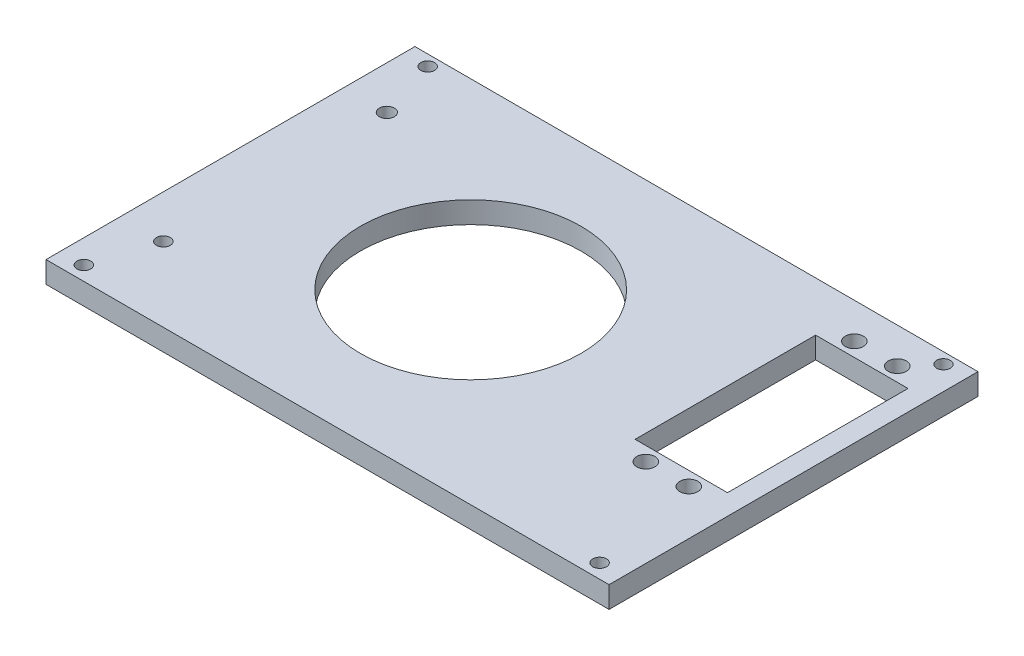
ISO-10303-21;
HEADER;
FILE_DESCRIPTION(('STEP AP214'),'2;1');
FILE_NAME('part.step','',(''),(''),'','','');
FILE_SCHEMA(('AUTOMOTIVE_DESIGN { 1 0 10303 214 1 1 1 1 }'));
ENDSEC;
DATA;
#1=APPLICATION_CONTEXT('core data for automotive mechanical design processes');
#2=APPLICATION_PROTOCOL_DEFINITION('international standard','automotive_design',2000,#1);
#3=PRODUCT_CONTEXT('',#1,'mechanical');
#4=PRODUCT('Part','Part','',(#3));
#5=PRODUCT_RELATED_PRODUCT_CATEGORY('part','',(#4));
#6=PRODUCT_DEFINITION_FORMATION('','',#4);
#7=PRODUCT_DEFINITION_CONTEXT('part definition',#1,'design');
#8=PRODUCT_DEFINITION('design','',#6,#7);
#9=PRODUCT_DEFINITION_SHAPE('','',#8);
#10=(LENGTH_UNIT() NAMED_UNIT(*) SI_UNIT(.MILLI.,.METRE.));
#11=(NAMED_UNIT(*) PLANE_ANGLE_UNIT() SI_UNIT($,.RADIAN.));
#12=(NAMED_UNIT(*) SI_UNIT($,.STERADIAN.) SOLID_ANGLE_UNIT());
#13=UNCERTAINTY_MEASURE_WITH_UNIT(LENGTH_MEASURE(1.E-05),#10,'distance_accuracy_value','');
#14=(GEOMETRIC_REPRESENTATION_CONTEXT(3) GLOBAL_UNCERTAINTY_ASSIGNED_CONTEXT((#13)) GLOBAL_UNIT_ASSIGNED_CONTEXT((#10,
#11,#12)) REPRESENTATION_CONTEXT('',''));
#15=CARTESIAN_POINT('',(0.,0.,0.));
#16=DIRECTION('',(0.,0.,1.));
#17=DIRECTION('',(1.,0.,0.));
#18=AXIS2_PLACEMENT_3D('',#15,#16,#17);
#19=CARTESIAN_POINT('',(0.,5.,0.));
#20=DIRECTION('',(0.,-1.,0.));
#21=DIRECTION('',(0.,0.,-1.));
#22=AXIS2_PLACEMENT_3D('',#19,#20,#21);
#23=PLANE('',#22);
#24=CARTESIAN_POINT('',(-60.0000000000002,5.,-39.9999999999992));
#25=DIRECTION('',(0.,1.,0.));
#26=DIRECTION('',(0.,0.,1.));
#27=AXIS2_PLACEMENT_3D('',#24,#25,#26);
#28=CIRCLE('',#27,1.6);
#29=CARTESIAN_POINT('',(-60.0000000000002,5.,-38.3999999999992));
#30=VERTEX_POINT('',#29);
#31=EDGE_CURVE('E137',#30,#30,#28,.T.);
#32=ORIENTED_EDGE('',*,*,#31,.F.);
#33=EDGE_LOOP('',(#32));
#34=FACE_BOUND('',#33,.T.);
#35=CARTESIAN_POINT('',(-10.,5.,0.));
#36=DIRECTION('',(0.,1.,0.));
#37=DIRECTION('',(0.,0.,1.));
#38=AXIS2_PLACEMENT_3D('',#35,#36,#37);
#39=CIRCLE('',#38,25.65);
#40=CARTESIAN_POINT('',(-10.,5.,25.65));
#41=VERTEX_POINT('',#40);
#42=EDGE_CURVE('E143',#41,#41,#39,.T.);
#43=ORIENTED_EDGE('',*,*,#42,.F.);
#44=EDGE_LOOP('',(#43));
#45=FACE_BOUND('',#44,.T.);
#46=CARTESIAN_POINT('',(55.,5.,-34.25));
#47=DIRECTION('',(0.,1.,0.));
#48=DIRECTION('',(0.,0.,1.));
#49=AXIS2_PLACEMENT_3D('',#46,#47,#48);
#50=CIRCLE('',#49,2.1);
#51=CARTESIAN_POINT('',(55.,5.,-32.15));
#52=VERTEX_POINT('',#51);
#53=EDGE_CURVE('E149',#52,#52,#50,.T.);
#54=ORIENTED_EDGE('',*,*,#53,.F.);
#55=EDGE_LOOP('',(#54));
#56=FACE_BOUND('',#55,.T.);
#57=CARTESIAN_POINT('',(-55.5000000000002,5.,-26.));
#58=DIRECTION('',(0.,1.,0.));
#59=DIRECTION('',(0.,0.,1.));
#60=AXIS2_PLACEMENT_3D('',#57,#58,#59);
#61=CIRCLE('',#60,1.75);
#62=CARTESIAN_POINT('',(-55.5000000000002,5.,-24.25));
#63=VERTEX_POINT('',#62);
#64=EDGE_CURVE('E155',#63,#63,#61,.T.);
#65=ORIENTED_EDGE('',*,*,#64,.F.);
#66=EDGE_LOOP('',(#65));
#67=FACE_BOUND('',#66,.T.);
#68=CARTESIAN_POINT('',(45.,5.,-34.25));
#69=DIRECTION('',(0.,1.,0.));
#70=DIRECTION('',(0.,0.,1.));
#71=AXIS2_PLACEMENT_3D('',#68,#69,#70);
#72=CIRCLE('',#71,2.1);
#73=CARTESIAN_POINT('',(45.,5.,-32.15));
#74=VERTEX_POINT('',#73);
#75=EDGE_CURVE('E161',#74,#74,#72,.T.);
#76=ORIENTED_EDGE('',*,*,#75,.F.);
#77=EDGE_LOOP('',(#76));
#78=FACE_BOUND('',#77,.T.);
#79=CARTESIAN_POINT('',(59.9999999999998,5.,-40.));
#80=DIRECTION('',(0.,1.,0.));
#81=DIRECTION('',(0.,0.,1.));
#82=AXIS2_PLACEMENT_3D('',#79,#80,#81);
#83=CIRCLE('',#82,1.6);
#84=CARTESIAN_POINT('',(59.9999999999998,5.,-38.4));
#85=VERTEX_POINT('',#84);
#86=EDGE_CURVE('E167',#85,#85,#83,.T.);
#87=ORIENTED_EDGE('',*,*,#86,.F.);
#88=EDGE_LOOP('',(#87));
#89=FACE_BOUND('',#88,.T.);
#90=CARTESIAN_POINT('',(60.,5.,40.));
#91=DIRECTION('',(0.,1.,0.));
#92=DIRECTION('',(0.,0.,1.));
#93=AXIS2_PLACEMENT_3D('',#90,#91,#92);
#94=CIRCLE('',#93,1.6);
#95=CARTESIAN_POINT('',(60.,5.,41.6));
#96=VERTEX_POINT('',#95);
#97=EDGE_CURVE('E173',#96,#96,#94,.T.);
#98=ORIENTED_EDGE('',*,*,#97,.F.);
#99=EDGE_LOOP('',(#98));
#100=FACE_BOUND('',#99,.T.);
#101=CARTESIAN_POINT('',(-60.,5.,40.0000000000008));
#102=DIRECTION('',(0.,1.,0.));
#103=DIRECTION('',(0.,0.,1.));
#104=AXIS2_PLACEMENT_3D('',#101,#102,#103);
#105=CIRCLE('',#104,1.6);
#106=CARTESIAN_POINT('',(-60.,5.,41.6000000000008));
#107=VERTEX_POINT('',#106);
#108=EDGE_CURVE('E179',#107,#107,#105,.T.);
#109=ORIENTED_EDGE('',*,*,#108,.F.);
#110=EDGE_LOOP('',(#109));
#111=FACE_BOUND('',#110,.T.);
#112=CARTESIAN_POINT('',(-55.5,5.,26.));
#113=DIRECTION('',(0.,1.,0.));
#114=DIRECTION('',(0.,0.,1.));
#115=AXIS2_PLACEMENT_3D('',#112,#113,#114);
#116=CIRCLE('',#115,1.6);
#117=CARTESIAN_POINT('',(-55.5,5.,27.6));
#118=VERTEX_POINT('',#117);
#119=EDGE_CURVE('E185',#118,#118,#116,.T.);
#120=ORIENTED_EDGE('',*,*,#119,.F.);
#121=EDGE_LOOP('',(#120));
#122=FACE_BOUND('',#121,.T.);
#123=DIRECTION('',(-1.,0.,0.));
#124=VECTOR('',#123,1.);
#125=CARTESIAN_POINT('',(-65.5,5.,-42.5319738960787));
#126=LINE('',#125,#124);
#127=CARTESIAN_POINT('',(65.5,5.,-42.5319738960787));
#128=VERTEX_POINT('',#127);
#129=CARTESIAN_POINT('',(-65.5,5.,-42.5319738960787));
#130=VERTEX_POINT('',#129);
#131=EDGE_CURVE('E191',#128,#130,#126,.T.);
#132=ORIENTED_EDGE('',*,*,#131,.T.);
#133=DIRECTION('',(0.,0.,1.));
#134=VECTOR('',#133,1.);
#135=CARTESIAN_POINT('',(-65.5,5.,-42.5319738960787));
#136=LINE('',#135,#134);
#137=CARTESIAN_POINT('',(-65.5,5.,43.3037538041827));
#138=VERTEX_POINT('',#137);
#139=EDGE_CURVE('E194',#130,#138,#136,.T.);
#140=ORIENTED_EDGE('',*,*,#139,.T.);
#141=DIRECTION('',(1.,0.,0.));
#142=VECTOR('',#141,1.);
#143=CARTESIAN_POINT('',(65.5,5.,43.3037538041826));
#144=LINE('',#143,#142);
#145=CARTESIAN_POINT('',(65.5,5.,43.3037538041826));
#146=VERTEX_POINT('',#145);
#147=EDGE_CURVE('E197',#138,#146,#144,.T.);
#148=ORIENTED_EDGE('',*,*,#147,.T.);
#149=DIRECTION('',(0.,0.,-1.));
#150=VECTOR('',#149,1.);
#151=CARTESIAN_POINT('',(65.5,5.,-42.5319738960787));
#152=LINE('',#151,#150);
#153=EDGE_CURVE('E199',#146,#128,#152,.T.);
#154=ORIENTED_EDGE('',*,*,#153,.T.);
#155=EDGE_LOOP('',(#132,#140,#148,#154));
#156=FACE_BOUND('',#155,.T.);
#157=DIRECTION('',(0.,0.,-1.));
#158=VECTOR('',#157,1.);
#159=CARTESIAN_POINT('',(60.75,5.,-31.));
#160=LINE('',#159,#158);
#161=CARTESIAN_POINT('',(60.75,5.,11.));
#162=VERTEX_POINT('',#161);
#163=CARTESIAN_POINT('',(60.75,5.,-31.));
#164=VERTEX_POINT('',#163);
#165=EDGE_CURVE('E98',#162,#164,#160,.T.);
#166=ORIENTED_EDGE('',*,*,#165,.F.);
#167=DIRECTION('',(1.,0.,0.));
#168=VECTOR('',#167,1.);
#169=CARTESIAN_POINT('',(39.25,5.,11.));
#170=LINE('',#169,#168);
#171=CARTESIAN_POINT('',(39.25,5.,11.));
#172=VERTEX_POINT('',#171);
#173=EDGE_CURVE('E121',#172,#162,#170,.T.);
#174=ORIENTED_EDGE('',*,*,#173,.F.);
#175=DIRECTION('',(0.,0.,1.));
#176=VECTOR('',#175,1.);
#177=CARTESIAN_POINT('',(39.25,5.,-31.));
#178=LINE('',#177,#176);
#179=CARTESIAN_POINT('',(39.25,5.,-31.));
#180=VERTEX_POINT('',#179);
#181=EDGE_CURVE('E119',#180,#172,#178,.T.);
#182=ORIENTED_EDGE('',*,*,#181,.F.);
#183=DIRECTION('',(-1.,0.,0.));
#184=VECTOR('',#183,1.);
#185=CARTESIAN_POINT('',(39.25,5.,-31.));
#186=LINE('',#185,#184);
#187=EDGE_CURVE('E106',#164,#180,#186,.T.);
#188=ORIENTED_EDGE('',*,*,#187,.F.);
#189=EDGE_LOOP('',(#166,#174,#182,#188));
#190=FACE_BOUND('',#189,.T.);
#191=CARTESIAN_POINT('',(45.0000000000005,5.,14.25));
#192=DIRECTION('',(0.,1.,0.));
#193=DIRECTION('',(0.,0.,1.));
#194=AXIS2_PLACEMENT_3D('',#191,#192,#193);
#195=CIRCLE('',#194,2.1);
#196=CARTESIAN_POINT('',(45.0000000000005,5.,16.35));
#197=VERTEX_POINT('',#196);
#198=EDGE_CURVE('E127',#197,#197,#195,.T.);
#199=ORIENTED_EDGE('',*,*,#198,.F.);
#200=EDGE_LOOP('',(#199));
#201=FACE_BOUND('',#200,.T.);
#202=CARTESIAN_POINT('',(55.0000000000005,5.,14.25));
#203=DIRECTION('',(0.,1.,0.));
#204=DIRECTION('',(0.,0.,1.));
#205=AXIS2_PLACEMENT_3D('',#202,#203,#204);
#206=CIRCLE('',#205,2.1);
#207=CARTESIAN_POINT('',(55.0000000000005,5.,16.35));
#208=VERTEX_POINT('',#207);
#209=EDGE_CURVE('E283',#208,#208,#206,.T.);
#210=ORIENTED_EDGE('',*,*,#209,.F.);
#211=EDGE_LOOP('',(#210));
#212=FACE_BOUND('',#211,.T.);
#213=ADVANCED_FACE('F33',(#34,#45,#56,#67,#78,#89,#100,#111,#122,#156,#190,#201,#212),#23,.F.);
#214=CARTESIAN_POINT('',(0.,0.,0.));
#215=DIRECTION('',(0.,-1.,0.));
#216=DIRECTION('',(0.,0.,-1.));
#217=AXIS2_PLACEMENT_3D('',#214,#215,#216);
#218=PLANE('',#217);
#219=CARTESIAN_POINT('',(45.0000000000005,0.,14.25));
#220=DIRECTION('',(0.,1.,0.));
#221=DIRECTION('',(0.,0.,1.));
#222=AXIS2_PLACEMENT_3D('',#219,#220,#221);
#223=CIRCLE('',#222,2.1);
#224=CARTESIAN_POINT('',(45.0000000000005,0.,16.35));
#225=VERTEX_POINT('',#224);
#226=EDGE_CURVE('E286',#225,#225,#223,.T.);
#227=ORIENTED_EDGE('',*,*,#226,.T.);
#228=EDGE_LOOP('',(#227));
#229=FACE_BOUND('',#228,.T.);
#230=CARTESIAN_POINT('',(-10.,0.,0.));
#231=DIRECTION('',(0.,1.,0.));
#232=DIRECTION('',(0.,0.,1.));
#233=AXIS2_PLACEMENT_3D('',#230,#231,#232);
#234=CIRCLE('',#233,25.65);
#235=CARTESIAN_POINT('',(-10.,0.,25.65));
#236=VERTEX_POINT('',#235);
#237=EDGE_CURVE('E140',#236,#236,#234,.T.);
#238=ORIENTED_EDGE('',*,*,#237,.T.);
#239=EDGE_LOOP('',(#238));
#240=FACE_BOUND('',#239,.T.);
#241=CARTESIAN_POINT('',(-55.5000000000002,0.,-26.));
#242=DIRECTION('',(0.,1.,0.));
#243=DIRECTION('',(0.,0.,1.));
#244=AXIS2_PLACEMENT_3D('',#241,#242,#243);
#245=CIRCLE('',#244,1.75);
#246=CARTESIAN_POINT('',(-55.5000000000002,0.,-24.25));
#247=VERTEX_POINT('',#246);
#248=EDGE_CURVE('E152',#247,#247,#245,.T.);
#249=ORIENTED_EDGE('',*,*,#248,.T.);
#250=EDGE_LOOP('',(#249));
#251=FACE_BOUND('',#250,.T.);
#252=CARTESIAN_POINT('',(59.9999999999998,0.,-40.));
#253=DIRECTION('',(0.,1.,0.));
#254=DIRECTION('',(0.,0.,1.));
#255=AXIS2_PLACEMENT_3D('',#252,#253,#254);
#256=CIRCLE('',#255,1.6);
#257=CARTESIAN_POINT('',(59.9999999999998,0.,-38.4));
#258=VERTEX_POINT('',#257);
#259=EDGE_CURVE('E164',#258,#258,#256,.T.);
#260=ORIENTED_EDGE('',*,*,#259,.T.);
#261=EDGE_LOOP('',(#260));
#262=FACE_BOUND('',#261,.T.);
#263=CARTESIAN_POINT('',(-60.,0.,40.0000000000008));
#264=DIRECTION('',(0.,1.,0.));
#265=DIRECTION('',(0.,0.,1.));
#266=AXIS2_PLACEMENT_3D('',#263,#264,#265);
#267=CIRCLE('',#266,1.6);
#268=CARTESIAN_POINT('',(-60.,0.,41.6000000000008));
#269=VERTEX_POINT('',#268);
#270=EDGE_CURVE('E176',#269,#269,#267,.T.);
#271=ORIENTED_EDGE('',*,*,#270,.T.);
#272=EDGE_LOOP('',(#271));
#273=FACE_BOUND('',#272,.T.);
#274=DIRECTION('',(-1.,0.,0.));
#275=VECTOR('',#274,1.);
#276=CARTESIAN_POINT('',(-65.5,0.,-42.5319738960787));
#277=LINE('',#276,#275);
#278=CARTESIAN_POINT('',(65.5,0.,-42.5319738960787));
#279=VERTEX_POINT('',#278);
#280=CARTESIAN_POINT('',(-65.5,0.,-42.5319738960787));
#281=VERTEX_POINT('',#280);
#282=EDGE_CURVE('E188',#279,#281,#277,.T.);
#283=ORIENTED_EDGE('',*,*,#282,.F.);
#284=DIRECTION('',(0.,0.,-1.));
#285=VECTOR('',#284,1.);
#286=CARTESIAN_POINT('',(65.5,0.,-42.5319738960787));
#287=LINE('',#286,#285);
#288=CARTESIAN_POINT('',(65.5,0.,43.3037538041826));
#289=VERTEX_POINT('',#288);
#290=EDGE_CURVE('E195',#289,#279,#287,.T.);
#291=ORIENTED_EDGE('',*,*,#290,.F.);
#292=DIRECTION('',(1.,0.,0.));
#293=VECTOR('',#292,1.);
#294=CARTESIAN_POINT('',(65.5,0.,43.3037538041826));
#295=LINE('',#294,#293);
#296=CARTESIAN_POINT('',(-65.5,0.,43.3037538041827));
#297=VERTEX_POINT('',#296);
#298=EDGE_CURVE('E206',#297,#289,#295,.T.);
#299=ORIENTED_EDGE('',*,*,#298,.F.);
#300=DIRECTION('',(0.,0.,1.));
#301=VECTOR('',#300,1.);
#302=CARTESIAN_POINT('',(-65.5,0.,-42.5319738960787));
#303=LINE('',#302,#301);
#304=EDGE_CURVE('E204',#281,#297,#303,.T.);
#305=ORIENTED_EDGE('',*,*,#304,.F.);
#306=EDGE_LOOP('',(#283,#291,#299,#305));
#307=FACE_BOUND('',#306,.T.);
#308=CARTESIAN_POINT('',(-55.5,0.,26.));
#309=DIRECTION('',(0.,1.,0.));
#310=DIRECTION('',(0.,0.,1.));
#311=AXIS2_PLACEMENT_3D('',#308,#309,#310);
#312=CIRCLE('',#311,1.6);
#313=CARTESIAN_POINT('',(-55.5,0.,27.6));
#314=VERTEX_POINT('',#313);
#315=EDGE_CURVE('E182',#314,#314,#312,.T.);
#316=ORIENTED_EDGE('',*,*,#315,.T.);
#317=EDGE_LOOP('',(#316));
#318=FACE_BOUND('',#317,.T.);
#319=CARTESIAN_POINT('',(60.,0.,40.));
#320=DIRECTION('',(0.,1.,0.));
#321=DIRECTION('',(0.,0.,1.));
#322=AXIS2_PLACEMENT_3D('',#319,#320,#321);
#323=CIRCLE('',#322,1.6);
#324=CARTESIAN_POINT('',(60.,0.,41.6));
#325=VERTEX_POINT('',#324);
#326=EDGE_CURVE('E170',#325,#325,#323,.T.);
#327=ORIENTED_EDGE('',*,*,#326,.T.);
#328=EDGE_LOOP('',(#327));
#329=FACE_BOUND('',#328,.T.);
#330=CARTESIAN_POINT('',(45.,0.,-34.25));
#331=DIRECTION('',(0.,1.,0.));
#332=DIRECTION('',(0.,0.,1.));
#333=AXIS2_PLACEMENT_3D('',#330,#331,#332);
#334=CIRCLE('',#333,2.1);
#335=CARTESIAN_POINT('',(45.,0.,-32.15));
#336=VERTEX_POINT('',#335);
#337=EDGE_CURVE('E158',#336,#336,#334,.T.);
#338=ORIENTED_EDGE('',*,*,#337,.T.);
#339=EDGE_LOOP('',(#338));
#340=FACE_BOUND('',#339,.T.);
#341=CARTESIAN_POINT('',(55.,0.,-34.25));
#342=DIRECTION('',(0.,1.,0.));
#343=DIRECTION('',(0.,0.,1.));
#344=AXIS2_PLACEMENT_3D('',#341,#342,#343);
#345=CIRCLE('',#344,2.1);
#346=CARTESIAN_POINT('',(55.,0.,-32.15));
#347=VERTEX_POINT('',#346);
#348=EDGE_CURVE('E146',#347,#347,#345,.T.);
#349=ORIENTED_EDGE('',*,*,#348,.T.);
#350=EDGE_LOOP('',(#349));
#351=FACE_BOUND('',#350,.T.);
#352=CARTESIAN_POINT('',(-60.0000000000002,0.,-39.9999999999992));
#353=DIRECTION('',(0.,1.,0.));
#354=DIRECTION('',(0.,0.,1.));
#355=AXIS2_PLACEMENT_3D('',#352,#353,#354);
#356=CIRCLE('',#355,1.6);
#357=CARTESIAN_POINT('',(-60.0000000000002,0.,-38.3999999999992));
#358=VERTEX_POINT('',#357);
#359=EDGE_CURVE('E114',#358,#358,#356,.T.);
#360=ORIENTED_EDGE('',*,*,#359,.T.);
#361=EDGE_LOOP('',(#360));
#362=FACE_BOUND('',#361,.T.);
#363=DIRECTION('',(1.,0.,0.));
#364=VECTOR('',#363,1.);
#365=CARTESIAN_POINT('',(39.25,0.,11.));
#366=LINE('',#365,#364);
#367=CARTESIAN_POINT('',(39.25,0.,11.));
#368=VERTEX_POINT('',#367);
#369=CARTESIAN_POINT('',(60.75,0.,11.));
#370=VERTEX_POINT('',#369);
#371=EDGE_CURVE('E107',#368,#370,#366,.T.);
#372=ORIENTED_EDGE('',*,*,#371,.T.);
#373=DIRECTION('',(0.,0.,-1.));
#374=VECTOR('',#373,1.);
#375=CARTESIAN_POINT('',(60.75,0.,-31.));
#376=LINE('',#375,#374);
#377=CARTESIAN_POINT('',(60.75,0.,-31.));
#378=VERTEX_POINT('',#377);
#379=EDGE_CURVE('E56',#370,#378,#376,.T.);
#380=ORIENTED_EDGE('',*,*,#379,.T.);
#381=DIRECTION('',(-1.,0.,0.));
#382=VECTOR('',#381,1.);
#383=CARTESIAN_POINT('',(39.25,0.,-31.));
#384=LINE('',#383,#382);
#385=CARTESIAN_POINT('',(39.25,0.,-31.));
#386=VERTEX_POINT('',#385);
#387=EDGE_CURVE('E113',#378,#386,#384,.T.);
#388=ORIENTED_EDGE('',*,*,#387,.T.);
#389=DIRECTION('',(0.,0.,1.));
#390=VECTOR('',#389,1.);
#391=CARTESIAN_POINT('',(39.25,0.,-31.));
#392=LINE('',#391,#390);
#393=EDGE_CURVE('E129',#386,#368,#392,.T.);
#394=ORIENTED_EDGE('',*,*,#393,.T.);
#395=EDGE_LOOP('',(#372,#380,#388,#394));
#396=FACE_BOUND('',#395,.T.);
#397=CARTESIAN_POINT('',(55.0000000000005,0.,14.25));
#398=DIRECTION('',(0.,1.,0.));
#399=DIRECTION('',(0.,0.,1.));
#400=AXIS2_PLACEMENT_3D('',#397,#398,#399);
#401=CIRCLE('',#400,2.1);
#402=CARTESIAN_POINT('',(55.0000000000005,0.,16.35));
#403=VERTEX_POINT('',#402);
#404=EDGE_CURVE('E281',#403,#403,#401,.T.);
#405=ORIENTED_EDGE('',*,*,#404,.T.);
#406=EDGE_LOOP('',(#405));
#407=FACE_BOUND('',#406,.T.);
#408=ADVANCED_FACE('F224',(#229,#240,#251,#262,#273,#307,#318,#329,#340,#351,#362,#396,#407),
#218,.T.);
#409=CARTESIAN_POINT('',(-65.5,5.,-42.5319738960787));
#410=DIRECTION('',(0.,0.,1.));
#411=DIRECTION('',(1.,0.,0.));
#412=AXIS2_PLACEMENT_3D('',#409,#410,#411);
#413=PLANE('',#412);
#414=ORIENTED_EDGE('',*,*,#282,.T.);
#415=DIRECTION('',(0.,-1.,0.));
#416=VECTOR('',#415,1.);
#417=CARTESIAN_POINT('',(-65.5,5.,-42.5319738960787));
#418=LINE('',#417,#416);
#419=EDGE_CURVE('E11',#130,#281,#418,.T.);
#420=ORIENTED_EDGE('',*,*,#419,.F.);
#421=ORIENTED_EDGE('',*,*,#131,.F.);
#422=DIRECTION('',(0.,-1.,0.));
#423=VECTOR('',#422,1.);
#424=CARTESIAN_POINT('',(65.5,5.,-42.5319738960787));
#425=LINE('',#424,#423);
#426=EDGE_CURVE('E201',#128,#279,#425,.T.);
#427=ORIENTED_EDGE('',*,*,#426,.T.);
#428=EDGE_LOOP('',(#414,#420,#421,#427));
#429=FACE_BOUND('',#428,.T.);
#430=ADVANCED_FACE('F35',(#429),#413,.F.);
#431=CARTESIAN_POINT('',(-65.5,5.,-42.5319738960787));
#432=DIRECTION('',(1.,0.,0.));
#433=DIRECTION('',(0.,0.,-1.));
#434=AXIS2_PLACEMENT_3D('',#431,#432,#433);
#435=PLANE('',#434);
#436=ORIENTED_EDGE('',*,*,#304,.T.);
#437=DIRECTION('',(0.,-1.,0.));
#438=VECTOR('',#437,1.);
#439=CARTESIAN_POINT('',(-65.5,5.,43.3037538041827));
#440=LINE('',#439,#438);
#441=EDGE_CURVE('E41',#138,#297,#440,.T.);
#442=ORIENTED_EDGE('',*,*,#441,.F.);
#443=ORIENTED_EDGE('',*,*,#139,.F.);
#444=ORIENTED_EDGE('',*,*,#419,.T.);
#445=EDGE_LOOP('',(#436,#442,#443,#444));
#446=FACE_BOUND('',#445,.T.);
#447=ADVANCED_FACE('F234',(#446),#435,.F.);
#448=CARTESIAN_POINT('',(65.5,5.,43.3037538041826));
#449=DIRECTION('',(0.,0.,-1.));
#450=DIRECTION('',(-1.,0.,0.));
#451=AXIS2_PLACEMENT_3D('',#448,#449,#450);
#452=PLANE('',#451);
#453=ORIENTED_EDGE('',*,*,#298,.T.);
#454=DIRECTION('',(0.,-1.,0.));
#455=VECTOR('',#454,1.);
#456=CARTESIAN_POINT('',(65.5,5.,43.3037538041826));
#457=LINE('',#456,#455);
#458=EDGE_CURVE('E211',#146,#289,#457,.T.);
#459=ORIENTED_EDGE('',*,*,#458,.F.);
#460=ORIENTED_EDGE('',*,*,#147,.F.);
#461=ORIENTED_EDGE('',*,*,#441,.T.);
#462=EDGE_LOOP('',(#453,#459,#460,#461));
#463=FACE_BOUND('',#462,.T.);
#464=ADVANCED_FACE('F218',(#463),#452,.F.);
#465=CARTESIAN_POINT('',(65.5,5.,-42.5319738960787));
#466=DIRECTION('',(-1.,0.,0.));
#467=DIRECTION('',(0.,0.,1.));
#468=AXIS2_PLACEMENT_3D('',#465,#466,#467);
#469=PLANE('',#468);
#470=ORIENTED_EDGE('',*,*,#290,.T.);
#471=ORIENTED_EDGE('',*,*,#426,.F.);
#472=ORIENTED_EDGE('',*,*,#153,.F.);
#473=ORIENTED_EDGE('',*,*,#458,.T.);
#474=EDGE_LOOP('',(#470,#471,#472,#473));
#475=FACE_BOUND('',#474,.T.);
#476=ADVANCED_FACE('F228',(#475),#469,.F.);
#477=CARTESIAN_POINT('',(-55.5,5.,26.));
#478=DIRECTION('',(0.,-1.,0.));
#479=DIRECTION('',(0.,0.,-1.));
#480=AXIS2_PLACEMENT_3D('',#477,#478,#479);
#481=CYLINDRICAL_SURFACE('',#480,1.6);
#482=ORIENTED_EDGE('',*,*,#119,.T.);
#483=EDGE_LOOP('',(#482));
#484=FACE_BOUND('',#483,.T.);
#485=ORIENTED_EDGE('',*,*,#315,.F.);
#486=EDGE_LOOP('',(#485));
#487=FACE_BOUND('',#486,.T.);
#488=ADVANCED_FACE('F252',(#484,#487),#481,.F.);
#489=CARTESIAN_POINT('',(-60.,5.,40.0000000000008));
#490=DIRECTION('',(0.,-1.,0.));
#491=DIRECTION('',(0.,0.,-1.));
#492=AXIS2_PLACEMENT_3D('',#489,#490,#491);
#493=CYLINDRICAL_SURFACE('',#492,1.6);
#494=ORIENTED_EDGE('',*,*,#108,.T.);
#495=EDGE_LOOP('',(#494));
#496=FACE_BOUND('',#495,.T.);
#497=ORIENTED_EDGE('',*,*,#270,.F.);
#498=EDGE_LOOP('',(#497));
#499=FACE_BOUND('',#498,.T.);
#500=ADVANCED_FACE('F259',(#496,#499),#493,.F.);
#501=CARTESIAN_POINT('',(60.,5.,40.));
#502=DIRECTION('',(0.,-1.,0.));
#503=DIRECTION('',(0.,0.,-1.));
#504=AXIS2_PLACEMENT_3D('',#501,#502,#503);
#505=CYLINDRICAL_SURFACE('',#504,1.6);
#506=ORIENTED_EDGE('',*,*,#97,.T.);
#507=EDGE_LOOP('',(#506));
#508=FACE_BOUND('',#507,.T.);
#509=ORIENTED_EDGE('',*,*,#326,.F.);
#510=EDGE_LOOP('',(#509));
#511=FACE_BOUND('',#510,.T.);
#512=ADVANCED_FACE('F264',(#508,#511),#505,.F.);
#513=CARTESIAN_POINT('',(59.9999999999998,5.,-40.));
#514=DIRECTION('',(0.,-1.,0.));
#515=DIRECTION('',(0.,0.,-1.));
#516=AXIS2_PLACEMENT_3D('',#513,#514,#515);
#517=CYLINDRICAL_SURFACE('',#516,1.6);
#518=ORIENTED_EDGE('',*,*,#86,.T.);
#519=EDGE_LOOP('',(#518));
#520=FACE_BOUND('',#519,.T.);
#521=ORIENTED_EDGE('',*,*,#259,.F.);
#522=EDGE_LOOP('',(#521));
#523=FACE_BOUND('',#522,.T.);
#524=ADVANCED_FACE('F335',(#520,#523),#517,.F.);
#525=CARTESIAN_POINT('',(45.,5.,-34.25));
#526=DIRECTION('',(0.,-1.,0.));
#527=DIRECTION('',(0.,0.,-1.));
#528=AXIS2_PLACEMENT_3D('',#525,#526,#527);
#529=CYLINDRICAL_SURFACE('',#528,2.1);
#530=ORIENTED_EDGE('',*,*,#75,.T.);
#531=EDGE_LOOP('',(#530));
#532=FACE_BOUND('',#531,.T.);
#533=ORIENTED_EDGE('',*,*,#337,.F.);
#534=EDGE_LOOP('',(#533));
#535=FACE_BOUND('',#534,.T.);
#536=ADVANCED_FACE('F331',(#532,#535),#529,.F.);
#537=CARTESIAN_POINT('',(-55.5000000000002,5.,-26.));
#538=DIRECTION('',(0.,-1.,0.));
#539=DIRECTION('',(0.,0.,-1.));
#540=AXIS2_PLACEMENT_3D('',#537,#538,#539);
#541=CYLINDRICAL_SURFACE('',#540,1.75);
#542=ORIENTED_EDGE('',*,*,#64,.T.);
#543=EDGE_LOOP('',(#542));
#544=FACE_BOUND('',#543,.T.);
#545=ORIENTED_EDGE('',*,*,#248,.F.);
#546=EDGE_LOOP('',(#545));
#547=FACE_BOUND('',#546,.T.);
#548=ADVANCED_FACE('F327',(#544,#547),#541,.F.);
#549=CARTESIAN_POINT('',(55.,5.,-34.25));
#550=DIRECTION('',(0.,-1.,0.));
#551=DIRECTION('',(0.,0.,-1.));
#552=AXIS2_PLACEMENT_3D('',#549,#550,#551);
#553=CYLINDRICAL_SURFACE('',#552,2.1);
#554=ORIENTED_EDGE('',*,*,#53,.T.);
#555=EDGE_LOOP('',(#554));
#556=FACE_BOUND('',#555,.T.);
#557=ORIENTED_EDGE('',*,*,#348,.F.);
#558=EDGE_LOOP('',(#557));
#559=FACE_BOUND('',#558,.T.);
#560=ADVANCED_FACE('F323',(#556,#559),#553,.F.);
#561=CARTESIAN_POINT('',(-10.,5.,0.));
#562=DIRECTION('',(0.,-1.,0.));
#563=DIRECTION('',(0.,0.,-1.));
#564=AXIS2_PLACEMENT_3D('',#561,#562,#563);
#565=CYLINDRICAL_SURFACE('',#564,25.65);
#566=ORIENTED_EDGE('',*,*,#42,.T.);
#567=EDGE_LOOP('',(#566));
#568=FACE_BOUND('',#567,.T.);
#569=ORIENTED_EDGE('',*,*,#237,.F.);
#570=EDGE_LOOP('',(#569));
#571=FACE_BOUND('',#570,.T.);
#572=ADVANCED_FACE('F319',(#568,#571),#565,.F.);
#573=CARTESIAN_POINT('',(-60.0000000000002,5.,-39.9999999999992));
#574=DIRECTION('',(0.,-1.,0.));
#575=DIRECTION('',(0.,0.,-1.));
#576=AXIS2_PLACEMENT_3D('',#573,#574,#575);
#577=CYLINDRICAL_SURFACE('',#576,1.6);
#578=ORIENTED_EDGE('',*,*,#31,.T.);
#579=EDGE_LOOP('',(#578));
#580=FACE_BOUND('',#579,.T.);
#581=ORIENTED_EDGE('',*,*,#359,.F.);
#582=EDGE_LOOP('',(#581));
#583=FACE_BOUND('',#582,.T.);
#584=ADVANCED_FACE('F316',(#580,#583),#577,.F.);
#585=CARTESIAN_POINT('',(60.75,5.,-31.));
#586=DIRECTION('',(-1.,0.,0.));
#587=DIRECTION('',(0.,0.,1.));
#588=AXIS2_PLACEMENT_3D('',#585,#586,#587);
#589=PLANE('',#588);
#590=ORIENTED_EDGE('',*,*,#379,.F.);
#591=DIRECTION('',(0.,-1.,0.));
#592=VECTOR('',#591,1.);
#593=CARTESIAN_POINT('',(60.75,5.,11.));
#594=LINE('',#593,#592);
#595=EDGE_CURVE('E102',#162,#370,#594,.T.);
#596=ORIENTED_EDGE('',*,*,#595,.F.);
#597=ORIENTED_EDGE('',*,*,#165,.T.);
#598=DIRECTION('',(0.,-1.,0.));
#599=VECTOR('',#598,1.);
#600=CARTESIAN_POINT('',(60.75,5.,-31.));
#601=LINE('',#600,#599);
#602=EDGE_CURVE('E101',#164,#378,#601,.T.);
#603=ORIENTED_EDGE('',*,*,#602,.T.);
#604=EDGE_LOOP('',(#590,#596,#597,#603));
#605=FACE_BOUND('',#604,.T.);
#606=ADVANCED_FACE('F100',(#605),#589,.T.);
#607=CARTESIAN_POINT('',(39.25,5.,-31.));
#608=DIRECTION('',(0.,0.,1.));
#609=DIRECTION('',(1.,0.,0.));
#610=AXIS2_PLACEMENT_3D('',#607,#608,#609);
#611=PLANE('',#610);
#612=ORIENTED_EDGE('',*,*,#387,.F.);
#613=ORIENTED_EDGE('',*,*,#602,.F.);
#614=ORIENTED_EDGE('',*,*,#187,.T.);
#615=DIRECTION('',(0.,-1.,0.));
#616=VECTOR('',#615,1.);
#617=CARTESIAN_POINT('',(39.25,5.,-31.));
#618=LINE('',#617,#616);
#619=EDGE_CURVE('E115',#180,#386,#618,.T.);
#620=ORIENTED_EDGE('',*,*,#619,.T.);
#621=EDGE_LOOP('',(#612,#613,#614,#620));
#622=FACE_BOUND('',#621,.T.);
#623=ADVANCED_FACE('F110',(#622),#611,.T.);
#624=CARTESIAN_POINT('',(39.25,5.,-31.));
#625=DIRECTION('',(1.,0.,0.));
#626=DIRECTION('',(0.,0.,-1.));
#627=AXIS2_PLACEMENT_3D('',#624,#625,#626);
#628=PLANE('',#627);
#629=ORIENTED_EDGE('',*,*,#393,.F.);
#630=ORIENTED_EDGE('',*,*,#619,.F.);
#631=ORIENTED_EDGE('',*,*,#181,.T.);
#632=DIRECTION('',(0.,-1.,0.));
#633=VECTOR('',#632,1.);
#634=CARTESIAN_POINT('',(39.25,5.,11.));
#635=LINE('',#634,#633);
#636=EDGE_CURVE('E48',#172,#368,#635,.T.);
#637=ORIENTED_EDGE('',*,*,#636,.T.);
#638=EDGE_LOOP('',(#629,#630,#631,#637));
#639=FACE_BOUND('',#638,.T.);
#640=ADVANCED_FACE('F306',(#639),#628,.T.);
#641=CARTESIAN_POINT('',(39.25,5.,11.));
#642=DIRECTION('',(0.,0.,-1.));
#643=DIRECTION('',(-1.,0.,0.));
#644=AXIS2_PLACEMENT_3D('',#641,#642,#643);
#645=PLANE('',#644);
#646=ORIENTED_EDGE('',*,*,#371,.F.);
#647=ORIENTED_EDGE('',*,*,#636,.F.);
#648=ORIENTED_EDGE('',*,*,#173,.T.);
#649=ORIENTED_EDGE('',*,*,#595,.T.);
#650=EDGE_LOOP('',(#646,#647,#648,#649));
#651=FACE_BOUND('',#650,.T.);
#652=ADVANCED_FACE('F297',(#651),#645,.T.);
#653=CARTESIAN_POINT('',(45.0000000000005,5.,14.25));
#654=DIRECTION('',(0.,-1.,0.));
#655=DIRECTION('',(0.,0.,-1.));
#656=AXIS2_PLACEMENT_3D('',#653,#654,#655);
#657=CYLINDRICAL_SURFACE('',#656,2.1);
#658=ORIENTED_EDGE('',*,*,#198,.T.);
#659=EDGE_LOOP('',(#658));
#660=FACE_BOUND('',#659,.T.);
#661=ORIENTED_EDGE('',*,*,#226,.F.);
#662=EDGE_LOOP('',(#661));
#663=FACE_BOUND('',#662,.T.);
#664=ADVANCED_FACE('F294',(#660,#663),#657,.F.);
#665=CARTESIAN_POINT('',(55.0000000000005,5.,14.25));
#666=DIRECTION('',(0.,-1.,0.));
#667=DIRECTION('',(0.,0.,-1.));
#668=AXIS2_PLACEMENT_3D('',#665,#666,#667);
#669=CYLINDRICAL_SURFACE('',#668,2.1);
#670=ORIENTED_EDGE('',*,*,#209,.T.);
#671=EDGE_LOOP('',(#670));
#672=FACE_BOUND('',#671,.T.);
#673=ORIENTED_EDGE('',*,*,#404,.F.);
#674=EDGE_LOOP('',(#673));
#675=FACE_BOUND('',#674,.T.);
#676=ADVANCED_FACE('F296',(#672,#675),#669,.F.);
#677=CLOSED_SHELL('',(#213,#408,#430,#447,#464,#476,#488,#500,#512,#524,#536,#548,#560,#572,
#584,#606,#623,#640,#652,#664,#676));
#678=MANIFOLD_SOLID_BREP('B2',#677);
#679=ADVANCED_BREP_SHAPE_REPRESENTATION('',(#18,#678),#14);
#680=SHAPE_DEFINITION_REPRESENTATION(#9,#679);
ENDSEC;
END-ISO-10303-21;
